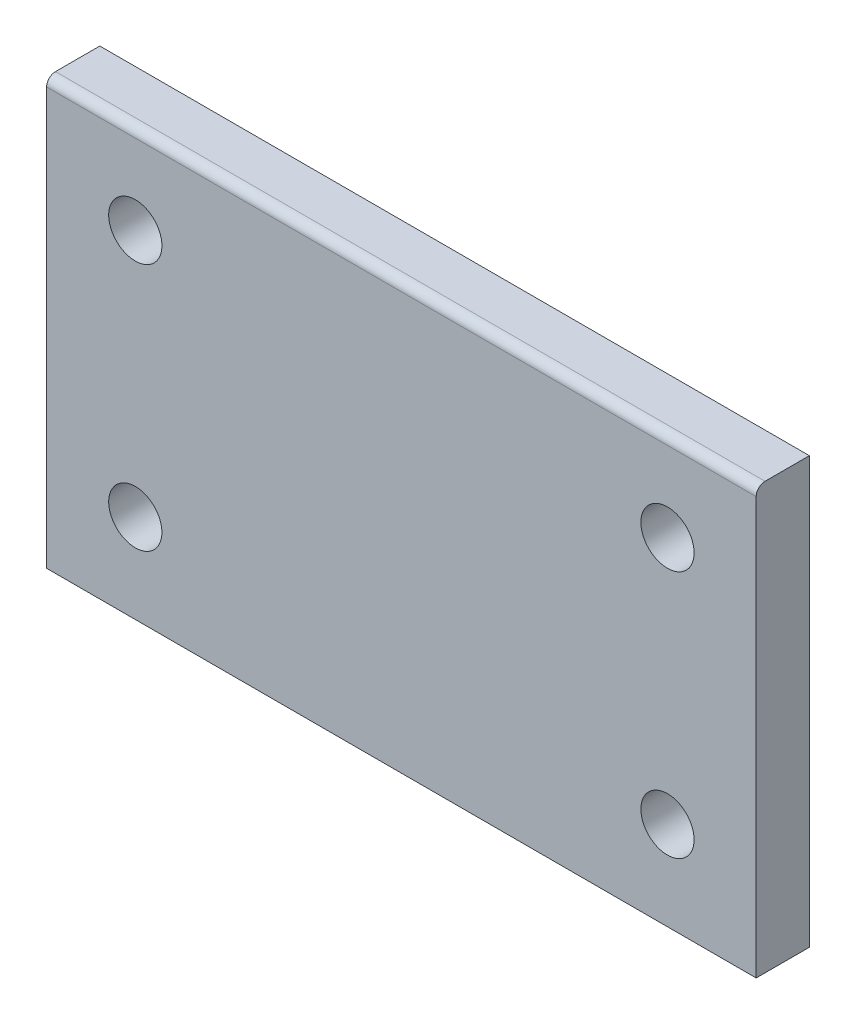
ISO-10303-21;
HEADER;
FILE_DESCRIPTION(('STEP AP214'),'2;1');
FILE_NAME('part.step','',(''),(''),'','','');
FILE_SCHEMA(('AUTOMOTIVE_DESIGN { 1 0 10303 214 1 1 1 1 }'));
ENDSEC;
DATA;
#1=APPLICATION_CONTEXT('core data for automotive mechanical design processes');
#2=APPLICATION_PROTOCOL_DEFINITION('international standard','automotive_design',2000,#1);
#3=PRODUCT_CONTEXT('',#1,'mechanical');
#4=PRODUCT('Part','Part','',(#3));
#5=PRODUCT_RELATED_PRODUCT_CATEGORY('part','',(#4));
#6=PRODUCT_DEFINITION_FORMATION('','',#4);
#7=PRODUCT_DEFINITION_CONTEXT('part definition',#1,'design');
#8=PRODUCT_DEFINITION('design','',#6,#7);
#9=PRODUCT_DEFINITION_SHAPE('','',#8);
#10=(LENGTH_UNIT() NAMED_UNIT(*) SI_UNIT(.MILLI.,.METRE.));
#11=(NAMED_UNIT(*) PLANE_ANGLE_UNIT() SI_UNIT($,.RADIAN.));
#12=(NAMED_UNIT(*) SI_UNIT($,.STERADIAN.) SOLID_ANGLE_UNIT());
#13=UNCERTAINTY_MEASURE_WITH_UNIT(LENGTH_MEASURE(1.E-05),#10,'distance_accuracy_value','');
#14=(GEOMETRIC_REPRESENTATION_CONTEXT(3) GLOBAL_UNCERTAINTY_ASSIGNED_CONTEXT((#13)) GLOBAL_UNIT_ASSIGNED_CONTEXT((#10,
#11,#12)) REPRESENTATION_CONTEXT('',''));
#15=CARTESIAN_POINT('',(0.,0.,0.));
#16=DIRECTION('',(0.,0.,1.));
#17=DIRECTION('',(1.,0.,0.));
#18=AXIS2_PLACEMENT_3D('',#15,#16,#17);
#19=CARTESIAN_POINT('',(0.,0.,9.525));
#20=DIRECTION('',(1.,0.,0.));
#21=DIRECTION('',(0.,0.,-1.));
#22=AXIS2_PLACEMENT_3D('',#19,#20,#21);
#23=PLANE('',#22);
#24=DIRECTION('',(0.,-1.,0.));
#25=VECTOR('',#24,1.);
#26=CARTESIAN_POINT('',(0.,0.,9.525));
#27=LINE('',#26,#25);
#28=CARTESIAN_POINT('',(0.,74.6125,9.525));
#29=VERTEX_POINT('',#28);
#30=CARTESIAN_POINT('',(0.,0.,9.525));
#31=VERTEX_POINT('',#30);
#32=EDGE_CURVE('E84',#29,#31,#27,.T.);
#33=ORIENTED_EDGE('',*,*,#32,.F.);
#34=CARTESIAN_POINT('',(0.,74.6125,7.9375));
#35=DIRECTION('',(1.,0.,0.));
#36=DIRECTION('',(0.,0.,-1.));
#37=AXIS2_PLACEMENT_3D('',#34,#35,#36);
#38=CIRCLE('',#37,1.5875);
#39=CARTESIAN_POINT('',(0.,76.2,7.9375));
#40=VERTEX_POINT('',#39);
#41=EDGE_CURVE('E62',#29,#40,#38,.F.);
#42=ORIENTED_EDGE('',*,*,#41,.T.);
#43=DIRECTION('',(0.,0.,-1.));
#44=VECTOR('',#43,1.);
#45=CARTESIAN_POINT('',(0.,76.2,9.525));
#46=LINE('',#45,#44);
#47=CARTESIAN_POINT('',(0.,76.2,0.));
#48=VERTEX_POINT('',#47);
#49=EDGE_CURVE('E114',#40,#48,#46,.T.);
#50=ORIENTED_EDGE('',*,*,#49,.T.);
#51=DIRECTION('',(0.,-1.,0.));
#52=VECTOR('',#51,1.);
#53=CARTESIAN_POINT('',(0.,0.,0.));
#54=LINE('',#53,#52);
#55=CARTESIAN_POINT('',(0.,0.,0.));
#56=VERTEX_POINT('',#55);
#57=EDGE_CURVE('E104',#48,#56,#54,.T.);
#58=ORIENTED_EDGE('',*,*,#57,.T.);
#59=DIRECTION('',(0.,0.,-1.));
#60=VECTOR('',#59,1.);
#61=CARTESIAN_POINT('',(0.,0.,9.525));
#62=LINE('',#61,#60);
#63=EDGE_CURVE('E100',#31,#56,#62,.T.);
#64=ORIENTED_EDGE('',*,*,#63,.F.);
#65=EDGE_LOOP('',(#33,#42,#50,#58,#64));
#66=FACE_BOUND('',#65,.T.);
#67=ADVANCED_FACE('F39',(#66),#23,.F.);
#68=CARTESIAN_POINT('',(0.,0.,9.525));
#69=DIRECTION('',(0.,1.,0.));
#70=DIRECTION('',(0.,0.,1.));
#71=AXIS2_PLACEMENT_3D('',#68,#69,#70);
#72=PLANE('',#71);
#73=DIRECTION('',(1.,0.,0.));
#74=VECTOR('',#73,1.);
#75=CARTESIAN_POINT('',(0.,0.,0.));
#76=LINE('',#75,#74);
#77=CARTESIAN_POINT('',(127.,0.,0.));
#78=VERTEX_POINT('',#77);
#79=EDGE_CURVE('E118',#56,#78,#76,.T.);
#80=ORIENTED_EDGE('',*,*,#79,.T.);
#81=DIRECTION('',(0.,0.,-1.));
#82=VECTOR('',#81,1.);
#83=CARTESIAN_POINT('',(127.,0.,9.525));
#84=LINE('',#83,#82);
#85=CARTESIAN_POINT('',(127.,0.,9.525));
#86=VERTEX_POINT('',#85);
#87=EDGE_CURVE('E99',#86,#78,#84,.T.);
#88=ORIENTED_EDGE('',*,*,#87,.F.);
#89=DIRECTION('',(1.,0.,0.));
#90=VECTOR('',#89,1.);
#91=CARTESIAN_POINT('',(0.,0.,9.525));
#92=LINE('',#91,#90);
#93=EDGE_CURVE('E87',#31,#86,#92,.T.);
#94=ORIENTED_EDGE('',*,*,#93,.F.);
#95=ORIENTED_EDGE('',*,*,#63,.T.);
#96=EDGE_LOOP('',(#80,#88,#94,#95));
#97=FACE_BOUND('',#96,.T.);
#98=ADVANCED_FACE('F96',(#97),#72,.F.);
#99=CARTESIAN_POINT('',(127.,0.,9.525));
#100=DIRECTION('',(-1.,0.,0.));
#101=DIRECTION('',(0.,0.,1.));
#102=AXIS2_PLACEMENT_3D('',#99,#100,#101);
#103=PLANE('',#102);
#104=DIRECTION('',(0.,0.,-1.));
#105=VECTOR('',#104,1.);
#106=CARTESIAN_POINT('',(127.,76.2,9.525));
#107=LINE('',#106,#105);
#108=CARTESIAN_POINT('',(127.,76.2,7.9375));
#109=VERTEX_POINT('',#108);
#110=CARTESIAN_POINT('',(127.,76.2,0.));
#111=VERTEX_POINT('',#110);
#112=EDGE_CURVE('E107',#109,#111,#107,.T.);
#113=ORIENTED_EDGE('',*,*,#112,.F.);
#114=CARTESIAN_POINT('',(127.,74.6125,7.9375));
#115=DIRECTION('',(-1.,0.,0.));
#116=DIRECTION('',(0.,0.,1.));
#117=AXIS2_PLACEMENT_3D('',#114,#115,#116);
#118=CIRCLE('',#117,1.5875);
#119=CARTESIAN_POINT('',(127.,74.6125,9.525));
#120=VERTEX_POINT('',#119);
#121=EDGE_CURVE('E11',#109,#120,#118,.F.);
#122=ORIENTED_EDGE('',*,*,#121,.T.);
#123=DIRECTION('',(0.,1.,0.));
#124=VECTOR('',#123,1.);
#125=CARTESIAN_POINT('',(127.,0.,9.525));
#126=LINE('',#125,#124);
#127=EDGE_CURVE('E105',#86,#120,#126,.T.);
#128=ORIENTED_EDGE('',*,*,#127,.F.);
#129=ORIENTED_EDGE('',*,*,#87,.T.);
#130=DIRECTION('',(0.,1.,0.));
#131=VECTOR('',#130,1.);
#132=CARTESIAN_POINT('',(127.,0.,0.));
#133=LINE('',#132,#131);
#134=EDGE_CURVE('E119',#78,#111,#133,.T.);
#135=ORIENTED_EDGE('',*,*,#134,.T.);
#136=EDGE_LOOP('',(#113,#122,#128,#129,#135));
#137=FACE_BOUND('',#136,.T.);
#138=ADVANCED_FACE('F171',(#137),#103,.F.);
#139=CARTESIAN_POINT('',(0.,76.2,9.525));
#140=DIRECTION('',(0.,-1.,0.));
#141=DIRECTION('',(0.,0.,-1.));
#142=AXIS2_PLACEMENT_3D('',#139,#140,#141);
#143=PLANE('',#142);
#144=ORIENTED_EDGE('',*,*,#49,.F.);
#145=DIRECTION('',(-1.,0.,0.));
#146=VECTOR('',#145,1.);
#147=CARTESIAN_POINT('',(0.,76.2,7.9375));
#148=LINE('',#147,#146);
#149=EDGE_CURVE('E50',#40,#109,#148,.F.);
#150=ORIENTED_EDGE('',*,*,#149,.T.);
#151=ORIENTED_EDGE('',*,*,#112,.T.);
#152=DIRECTION('',(-1.,0.,0.));
#153=VECTOR('',#152,1.);
#154=CARTESIAN_POINT('',(0.,76.2,0.));
#155=LINE('',#154,#153);
#156=EDGE_CURVE('E95',#111,#48,#155,.T.);
#157=ORIENTED_EDGE('',*,*,#156,.T.);
#158=EDGE_LOOP('',(#144,#150,#151,#157));
#159=FACE_BOUND('',#158,.T.);
#160=ADVANCED_FACE('F179',(#159),#143,.F.);
#161=CARTESIAN_POINT('',(0.,0.,9.525));
#162=DIRECTION('',(0.,0.,-1.));
#163=DIRECTION('',(-1.,0.,0.));
#164=AXIS2_PLACEMENT_3D('',#161,#162,#163);
#165=PLANE('',#164);
#166=CARTESIAN_POINT('',(111.125,15.875,9.525));
#167=DIRECTION('',(0.,0.,1.));
#168=DIRECTION('',(1.,0.,0.));
#169=AXIS2_PLACEMENT_3D('',#166,#167,#168);
#170=CIRCLE('',#169,4.7625);
#171=CARTESIAN_POINT('',(115.8875,15.875,9.525));
#172=VERTEX_POINT('',#171);
#173=EDGE_CURVE('E139',#172,#172,#170,.T.);
#174=ORIENTED_EDGE('',*,*,#173,.F.);
#175=EDGE_LOOP('',(#174));
#176=FACE_BOUND('',#175,.T.);
#177=CARTESIAN_POINT('',(15.875,60.325,9.525));
#178=DIRECTION('',(0.,0.,1.));
#179=DIRECTION('',(1.,0.,0.));
#180=AXIS2_PLACEMENT_3D('',#177,#178,#179);
#181=CIRCLE('',#180,4.7625);
#182=CARTESIAN_POINT('',(20.6375,60.325,9.525));
#183=VERTEX_POINT('',#182);
#184=EDGE_CURVE('E132',#183,#183,#181,.T.);
#185=ORIENTED_EDGE('',*,*,#184,.F.);
#186=EDGE_LOOP('',(#185));
#187=FACE_BOUND('',#186,.T.);
#188=CARTESIAN_POINT('',(111.125,60.325,9.525));
#189=DIRECTION('',(0.,0.,1.));
#190=DIRECTION('',(1.,0.,0.));
#191=AXIS2_PLACEMENT_3D('',#188,#189,#190);
#192=CIRCLE('',#191,4.7625);
#193=CARTESIAN_POINT('',(115.8875,60.325,9.525));
#194=VERTEX_POINT('',#193);
#195=EDGE_CURVE('E141',#194,#194,#192,.T.);
#196=ORIENTED_EDGE('',*,*,#195,.F.);
#197=EDGE_LOOP('',(#196));
#198=FACE_BOUND('',#197,.T.);
#199=CARTESIAN_POINT('',(15.875,15.875,9.525));
#200=DIRECTION('',(0.,0.,1.));
#201=DIRECTION('',(1.,0.,0.));
#202=AXIS2_PLACEMENT_3D('',#199,#200,#201);
#203=CIRCLE('',#202,4.7625);
#204=CARTESIAN_POINT('',(20.6375,15.875,9.525));
#205=VERTEX_POINT('',#204);
#206=EDGE_CURVE('E124',#205,#205,#203,.T.);
#207=ORIENTED_EDGE('',*,*,#206,.F.);
#208=EDGE_LOOP('',(#207));
#209=FACE_BOUND('',#208,.T.);
#210=ORIENTED_EDGE('',*,*,#127,.T.);
#211=DIRECTION('',(-1.,0.,0.));
#212=VECTOR('',#211,1.);
#213=CARTESIAN_POINT('',(0.,74.6125,9.525));
#214=LINE('',#213,#212);
#215=EDGE_CURVE('E89',#120,#29,#214,.T.);
#216=ORIENTED_EDGE('',*,*,#215,.T.);
#217=ORIENTED_EDGE('',*,*,#32,.T.);
#218=ORIENTED_EDGE('',*,*,#93,.T.);
#219=EDGE_LOOP('',(#210,#216,#217,#218));
#220=FACE_BOUND('',#219,.T.);
#221=ADVANCED_FACE('F88',(#176,#187,#198,#209,#220),#165,.F.);
#222=CARTESIAN_POINT('',(0.,0.,0.));
#223=DIRECTION('',(0.,0.,-1.));
#224=DIRECTION('',(-1.,0.,0.));
#225=AXIS2_PLACEMENT_3D('',#222,#223,#224);
#226=PLANE('',#225);
#227=CARTESIAN_POINT('',(111.125,15.875,0.));
#228=DIRECTION('',(0.,0.,1.));
#229=DIRECTION('',(1.,0.,0.));
#230=AXIS2_PLACEMENT_3D('',#227,#228,#229);
#231=CIRCLE('',#230,4.7625);
#232=CARTESIAN_POINT('',(115.8875,15.875,0.));
#233=VERTEX_POINT('',#232);
#234=EDGE_CURVE('E126',#233,#233,#231,.T.);
#235=ORIENTED_EDGE('',*,*,#234,.T.);
#236=EDGE_LOOP('',(#235));
#237=FACE_BOUND('',#236,.T.);
#238=CARTESIAN_POINT('',(15.875,60.325,0.));
#239=DIRECTION('',(0.,0.,1.));
#240=DIRECTION('',(1.,0.,0.));
#241=AXIS2_PLACEMENT_3D('',#238,#239,#240);
#242=CIRCLE('',#241,4.7625);
#243=CARTESIAN_POINT('',(20.6375,60.325,0.));
#244=VERTEX_POINT('',#243);
#245=EDGE_CURVE('E131',#244,#244,#242,.T.);
#246=ORIENTED_EDGE('',*,*,#245,.T.);
#247=EDGE_LOOP('',(#246));
#248=FACE_BOUND('',#247,.T.);
#249=CARTESIAN_POINT('',(111.125,60.325,0.));
#250=DIRECTION('',(0.,0.,1.));
#251=DIRECTION('',(1.,0.,0.));
#252=AXIS2_PLACEMENT_3D('',#249,#250,#251);
#253=CIRCLE('',#252,4.7625);
#254=CARTESIAN_POINT('',(115.8875,60.325,0.));
#255=VERTEX_POINT('',#254);
#256=EDGE_CURVE('E133',#255,#255,#253,.T.);
#257=ORIENTED_EDGE('',*,*,#256,.T.);
#258=EDGE_LOOP('',(#257));
#259=FACE_BOUND('',#258,.T.);
#260=CARTESIAN_POINT('',(15.875,15.875,0.));
#261=DIRECTION('',(0.,0.,1.));
#262=DIRECTION('',(1.,0.,0.));
#263=AXIS2_PLACEMENT_3D('',#260,#261,#262);
#264=CIRCLE('',#263,4.7625);
#265=CARTESIAN_POINT('',(20.6375,15.875,0.));
#266=VERTEX_POINT('',#265);
#267=EDGE_CURVE('E125',#266,#266,#264,.T.);
#268=ORIENTED_EDGE('',*,*,#267,.T.);
#269=EDGE_LOOP('',(#268));
#270=FACE_BOUND('',#269,.T.);
#271=ORIENTED_EDGE('',*,*,#57,.F.);
#272=ORIENTED_EDGE('',*,*,#156,.F.);
#273=ORIENTED_EDGE('',*,*,#134,.F.);
#274=ORIENTED_EDGE('',*,*,#79,.F.);
#275=EDGE_LOOP('',(#271,#272,#273,#274));
#276=FACE_BOUND('',#275,.T.);
#277=ADVANCED_FACE('F149',(#237,#248,#259,#270,#276),#226,.T.);
#278=CARTESIAN_POINT('',(15.875,15.875,9.525));
#279=DIRECTION('',(0.,0.,-1.));
#280=DIRECTION('',(-1.,0.,0.));
#281=AXIS2_PLACEMENT_3D('',#278,#279,#280);
#282=CYLINDRICAL_SURFACE('',#281,4.7625);
#283=ORIENTED_EDGE('',*,*,#206,.T.);
#284=EDGE_LOOP('',(#283));
#285=FACE_BOUND('',#284,.T.);
#286=ORIENTED_EDGE('',*,*,#267,.F.);
#287=EDGE_LOOP('',(#286));
#288=FACE_BOUND('',#287,.T.);
#289=ADVANCED_FACE('F154',(#285,#288),#282,.F.);
#290=CARTESIAN_POINT('',(111.125,60.325,9.525));
#291=DIRECTION('',(0.,0.,-1.));
#292=DIRECTION('',(-1.,0.,0.));
#293=AXIS2_PLACEMENT_3D('',#290,#291,#292);
#294=CYLINDRICAL_SURFACE('',#293,4.7625);
#295=ORIENTED_EDGE('',*,*,#195,.T.);
#296=EDGE_LOOP('',(#295));
#297=FACE_BOUND('',#296,.T.);
#298=ORIENTED_EDGE('',*,*,#256,.F.);
#299=EDGE_LOOP('',(#298));
#300=FACE_BOUND('',#299,.T.);
#301=ADVANCED_FACE('F155',(#297,#300),#294,.F.);
#302=CARTESIAN_POINT('',(15.875,60.325,9.525));
#303=DIRECTION('',(0.,0.,-1.));
#304=DIRECTION('',(-1.,0.,0.));
#305=AXIS2_PLACEMENT_3D('',#302,#303,#304);
#306=CYLINDRICAL_SURFACE('',#305,4.7625);
#307=ORIENTED_EDGE('',*,*,#184,.T.);
#308=EDGE_LOOP('',(#307));
#309=FACE_BOUND('',#308,.T.);
#310=ORIENTED_EDGE('',*,*,#245,.F.);
#311=EDGE_LOOP('',(#310));
#312=FACE_BOUND('',#311,.T.);
#313=ADVANCED_FACE('F152',(#309,#312),#306,.F.);
#314=CARTESIAN_POINT('',(111.125,15.875,9.525));
#315=DIRECTION('',(0.,0.,-1.));
#316=DIRECTION('',(-1.,0.,0.));
#317=AXIS2_PLACEMENT_3D('',#314,#315,#316);
#318=CYLINDRICAL_SURFACE('',#317,4.7625);
#319=ORIENTED_EDGE('',*,*,#173,.T.);
#320=EDGE_LOOP('',(#319));
#321=FACE_BOUND('',#320,.T.);
#322=ORIENTED_EDGE('',*,*,#234,.F.);
#323=EDGE_LOOP('',(#322));
#324=FACE_BOUND('',#323,.T.);
#325=ADVANCED_FACE('F165',(#321,#324),#318,.F.);
#326=CARTESIAN_POINT('',(0.,74.6125,7.9375));
#327=DIRECTION('',(-1.,0.,0.));
#328=DIRECTION('',(0.,0.,1.));
#329=AXIS2_PLACEMENT_3D('',#326,#327,#328);
#330=CYLINDRICAL_SURFACE('',#329,1.5875);
#331=ORIENTED_EDGE('',*,*,#121,.F.);
#332=ORIENTED_EDGE('',*,*,#149,.F.);
#333=ORIENTED_EDGE('',*,*,#41,.F.);
#334=ORIENTED_EDGE('',*,*,#215,.F.);
#335=EDGE_LOOP('',(#331,#332,#333,#334));
#336=FACE_BOUND('',#335,.T.);
#337=ADVANCED_FACE('F41',(#336),#330,.T.);
#338=CLOSED_SHELL('',(#67,#98,#138,#160,#221,#277,#289,#301,#313,#325,#337));
#339=MANIFOLD_SOLID_BREP('B2',#338);
#340=ADVANCED_BREP_SHAPE_REPRESENTATION('',(#18,#339),#14);
#341=SHAPE_DEFINITION_REPRESENTATION(#9,#340);
ENDSEC;
END-ISO-10303-21;
